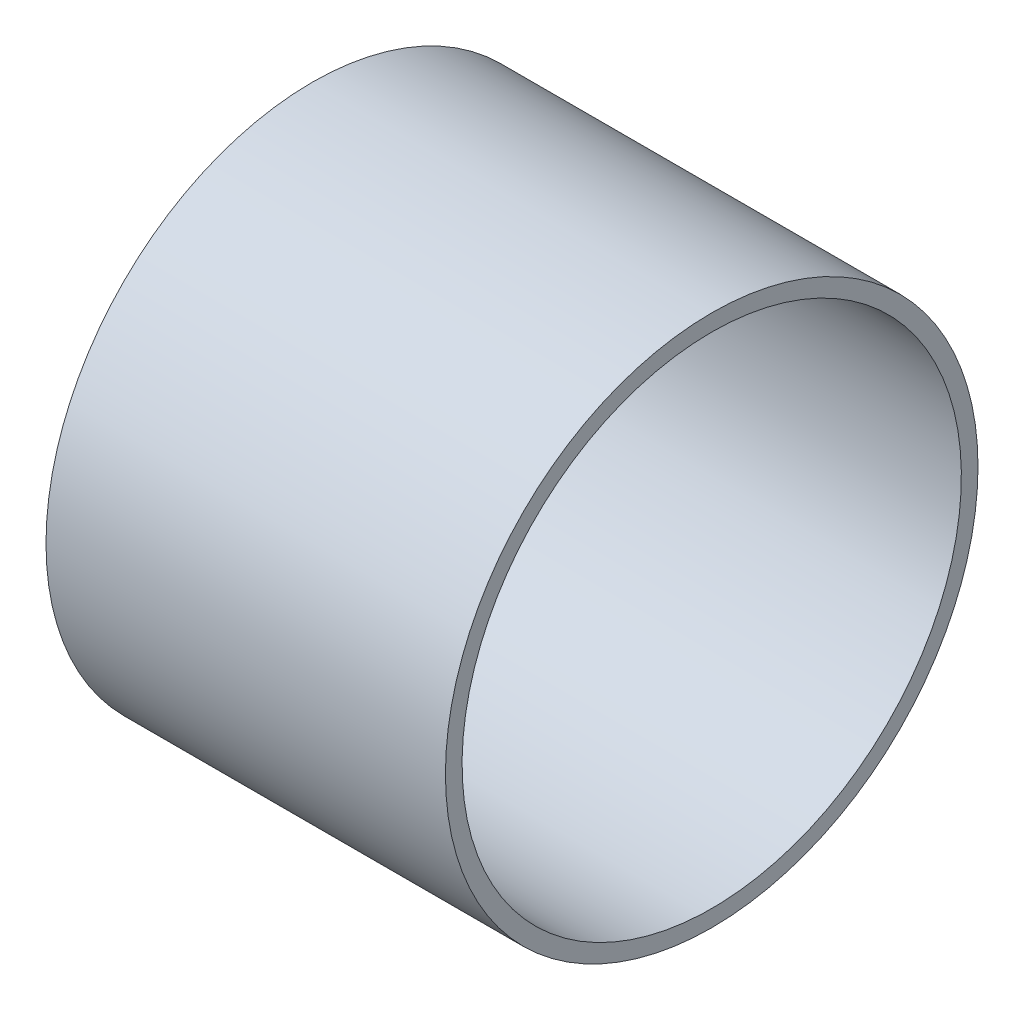
ISO-10303-21;
HEADER;
FILE_DESCRIPTION(('STEP AP214'),'2;1');
FILE_NAME('part.step','',(''),(''),'','','');
FILE_SCHEMA(('AUTOMOTIVE_DESIGN { 1 0 10303 214 1 1 1 1 }'));
ENDSEC;
DATA;
#1=APPLICATION_CONTEXT('core data for automotive mechanical design processes');
#2=APPLICATION_PROTOCOL_DEFINITION('international standard','automotive_design',2000,#1);
#3=PRODUCT_CONTEXT('',#1,'mechanical');
#4=PRODUCT('Part','Part','',(#3));
#5=PRODUCT_RELATED_PRODUCT_CATEGORY('part','',(#4));
#6=PRODUCT_DEFINITION_FORMATION('','',#4);
#7=PRODUCT_DEFINITION_CONTEXT('part definition',#1,'design');
#8=PRODUCT_DEFINITION('design','',#6,#7);
#9=PRODUCT_DEFINITION_SHAPE('','',#8);
#10=(LENGTH_UNIT() NAMED_UNIT(*) SI_UNIT(.MILLI.,.METRE.));
#11=(NAMED_UNIT(*) PLANE_ANGLE_UNIT() SI_UNIT($,.RADIAN.));
#12=(NAMED_UNIT(*) SI_UNIT($,.STERADIAN.) SOLID_ANGLE_UNIT());
#13=UNCERTAINTY_MEASURE_WITH_UNIT(LENGTH_MEASURE(1.E-05),#10,'distance_accuracy_value','');
#14=(GEOMETRIC_REPRESENTATION_CONTEXT(3) GLOBAL_UNCERTAINTY_ASSIGNED_CONTEXT((#13)) GLOBAL_UNIT_ASSIGNED_CONTEXT((#10,
#11,#12)) REPRESENTATION_CONTEXT('',''));
#15=CARTESIAN_POINT('',(0.,0.,0.));
#16=DIRECTION('',(0.,0.,1.));
#17=DIRECTION('',(1.,0.,0.));
#18=AXIS2_PLACEMENT_3D('',#15,#16,#17);
#19=CARTESIAN_POINT('',(0.,0.,0.));
#20=DIRECTION('',(1.,0.,0.));
#21=DIRECTION('',(0.,1.,0.));
#22=AXIS2_PLACEMENT_3D('',#19,#20,#21);
#23=PLANE('',#22);
#24=CARTESIAN_POINT('',(0.,0.,0.));
#25=DIRECTION('',(-1.,0.,0.));
#26=DIRECTION('',(0.,-1.,0.));
#27=AXIS2_PLACEMENT_3D('',#24,#25,#26);
#28=CIRCLE('',#27,7.5);
#29=CARTESIAN_POINT('',(0.,7.5,0.));
#30=VERTEX_POINT('',#29);
#31=EDGE_CURVE('E51',#30,#30,#28,.T.);
#32=ORIENTED_EDGE('',*,*,#31,.F.);
#33=EDGE_LOOP('',(#32));
#34=FACE_BOUND('',#33,.T.);
#35=CARTESIAN_POINT('',(0.,0.,0.));
#36=DIRECTION('',(1.,0.,0.));
#37=DIRECTION('',(0.,1.,0.));
#38=AXIS2_PLACEMENT_3D('',#35,#36,#37);
#39=CIRCLE('',#38,8.);
#40=CARTESIAN_POINT('',(0.,-8.,0.));
#41=VERTEX_POINT('',#40);
#42=EDGE_CURVE('E11',#41,#41,#39,.T.);
#43=ORIENTED_EDGE('',*,*,#42,.F.);
#44=EDGE_LOOP('',(#43));
#45=FACE_BOUND('',#44,.T.);
#46=ADVANCED_FACE('F17',(#34,#45),#23,.F.);
#47=CARTESIAN_POINT('',(12.,0.,0.));
#48=DIRECTION('',(1.,0.,0.));
#49=DIRECTION('',(0.,1.,0.));
#50=AXIS2_PLACEMENT_3D('',#47,#48,#49);
#51=PLANE('',#50);
#52=CARTESIAN_POINT('',(12.,0.,0.));
#53=DIRECTION('',(-1.,0.,0.));
#54=DIRECTION('',(0.,-1.,0.));
#55=AXIS2_PLACEMENT_3D('',#52,#53,#54);
#56=CIRCLE('',#55,7.5);
#57=CARTESIAN_POINT('',(12.,7.5,0.));
#58=VERTEX_POINT('',#57);
#59=EDGE_CURVE('E57',#58,#58,#56,.T.);
#60=ORIENTED_EDGE('',*,*,#59,.T.);
#61=EDGE_LOOP('',(#60));
#62=FACE_BOUND('',#61,.T.);
#63=CARTESIAN_POINT('',(12.,0.,0.));
#64=DIRECTION('',(1.,0.,0.));
#65=DIRECTION('',(0.,1.,0.));
#66=AXIS2_PLACEMENT_3D('',#63,#64,#65);
#67=CIRCLE('',#66,8.);
#68=CARTESIAN_POINT('',(12.,-8.,0.));
#69=VERTEX_POINT('',#68);
#70=EDGE_CURVE('E68',#69,#69,#67,.T.);
#71=ORIENTED_EDGE('',*,*,#70,.T.);
#72=EDGE_LOOP('',(#71));
#73=FACE_BOUND('',#72,.T.);
#74=ADVANCED_FACE('F60',(#62,#73),#51,.T.);
#75=CARTESIAN_POINT('',(0.,0.,0.));
#76=DIRECTION('',(1.,0.,0.));
#77=DIRECTION('',(0.,1.,0.));
#78=AXIS2_PLACEMENT_3D('',#75,#76,#77);
#79=CYLINDRICAL_SURFACE('',#78,8.);
#80=ORIENTED_EDGE('',*,*,#70,.F.);
#81=DIRECTION('',(-1.,0.,0.));
#82=VECTOR('',#81,1.);
#83=CARTESIAN_POINT('',(0.,-8.,0.));
#84=LINE('',#83,#82);
#85=EDGE_CURVE('E28',#69,#41,#84,.T.);
#86=ORIENTED_EDGE('',*,*,#85,.T.);
#87=ORIENTED_EDGE('',*,*,#42,.T.);
#88=ORIENTED_EDGE('',*,*,#85,.F.);
#89=EDGE_LOOP('',(#80,#86,#87,#88));
#90=FACE_BOUND('',#89,.T.);
#91=ADVANCED_FACE('F19',(#90),#79,.T.);
#92=CARTESIAN_POINT('',(0.,0.,0.));
#93=DIRECTION('',(1.,0.,0.));
#94=DIRECTION('',(0.,-1.,0.));
#95=AXIS2_PLACEMENT_3D('',#92,#93,#94);
#96=CYLINDRICAL_SURFACE('',#95,7.5);
#97=ORIENTED_EDGE('',*,*,#59,.F.);
#98=DIRECTION('',(-1.,0.,0.));
#99=VECTOR('',#98,1.);
#100=CARTESIAN_POINT('',(0.,7.5,0.));
#101=LINE('',#100,#99);
#102=EDGE_CURVE('E21',#58,#30,#101,.T.);
#103=ORIENTED_EDGE('',*,*,#102,.T.);
#104=ORIENTED_EDGE('',*,*,#31,.T.);
#105=ORIENTED_EDGE('',*,*,#102,.F.);
#106=EDGE_LOOP('',(#97,#103,#104,#105));
#107=FACE_BOUND('',#106,.T.);
#108=ADVANCED_FACE('F56',(#107),#96,.F.);
#109=CLOSED_SHELL('',(#46,#74,#91,#108));
#110=MANIFOLD_SOLID_BREP('B1',#109);
#111=ADVANCED_BREP_SHAPE_REPRESENTATION('',(#18,#110),#14);
#112=SHAPE_DEFINITION_REPRESENTATION(#9,#111);
ENDSEC;
END-ISO-10303-21;
